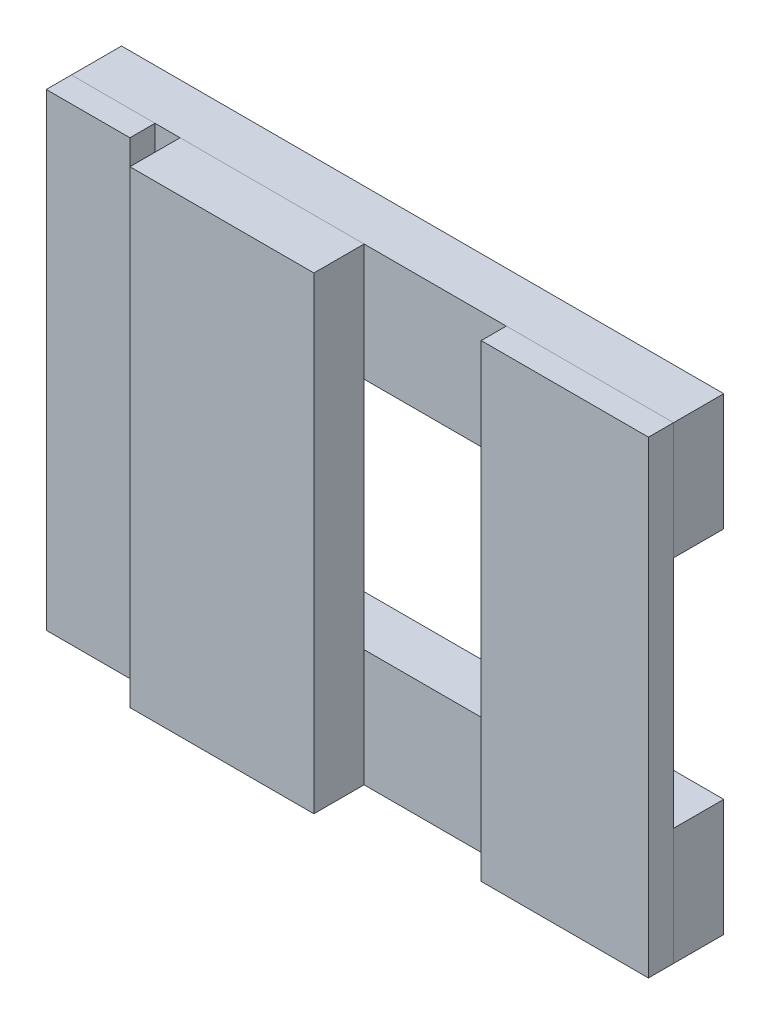
ISO-10303-21;
HEADER;
FILE_DESCRIPTION(('STEP AP214'),'2;1');
FILE_NAME('part.step','',(''),(''),'','','');
FILE_SCHEMA(('AUTOMOTIVE_DESIGN { 1 0 10303 214 1 1 1 1 }'));
ENDSEC;
DATA;
#1=APPLICATION_CONTEXT('core data for automotive mechanical design processes');
#2=APPLICATION_PROTOCOL_DEFINITION('international standard','automotive_design',2000,#1);
#3=PRODUCT_CONTEXT('',#1,'mechanical');
#4=PRODUCT('Part','Part','',(#3));
#5=PRODUCT_RELATED_PRODUCT_CATEGORY('part','',(#4));
#6=PRODUCT_DEFINITION_FORMATION('','',#4);
#7=PRODUCT_DEFINITION_CONTEXT('part definition',#1,'design');
#8=PRODUCT_DEFINITION('design','',#6,#7);
#9=PRODUCT_DEFINITION_SHAPE('','',#8);
#10=(LENGTH_UNIT() NAMED_UNIT(*) SI_UNIT(.MILLI.,.METRE.));
#11=(NAMED_UNIT(*) PLANE_ANGLE_UNIT() SI_UNIT($,.RADIAN.));
#12=(NAMED_UNIT(*) SI_UNIT($,.STERADIAN.) SOLID_ANGLE_UNIT());
#13=UNCERTAINTY_MEASURE_WITH_UNIT(LENGTH_MEASURE(1.E-05),#10,'distance_accuracy_value','');
#14=(GEOMETRIC_REPRESENTATION_CONTEXT(3) GLOBAL_UNCERTAINTY_ASSIGNED_CONTEXT((#13)) GLOBAL_UNIT_ASSIGNED_CONTEXT((#10,
#11,#12)) REPRESENTATION_CONTEXT('',''));
#15=CARTESIAN_POINT('',(0.,0.,0.));
#16=DIRECTION('',(0.,0.,1.));
#17=DIRECTION('',(1.,0.,0.));
#18=AXIS2_PLACEMENT_3D('',#15,#16,#17);
#19=CARTESIAN_POINT('',(-135.111715226845,177.8,76.2));
#20=DIRECTION('',(0.,1.,0.));
#21=DIRECTION('',(0.,0.,1.));
#22=AXIS2_PLACEMENT_3D('',#19,#20,#21);
#23=PLANE('',#22);
#24=DIRECTION('',(1.,0.,0.));
#25=VECTOR('',#24,1.);
#26=CARTESIAN_POINT('',(-135.111715226845,177.8,38.1));
#27=LINE('',#26,#25);
#28=CARTESIAN_POINT('',(-135.111715226845,177.8,38.1));
#29=VERTEX_POINT('',#28);
#30=CARTESIAN_POINT('',(4.58828477315457,177.8,38.1));
#31=VERTEX_POINT('',#30);
#32=EDGE_CURVE('E119',#29,#31,#27,.T.);
#33=ORIENTED_EDGE('',*,*,#32,.F.);
#34=DIRECTION('',(0.,0.,-1.));
#35=VECTOR('',#34,1.);
#36=CARTESIAN_POINT('',(-135.111715226845,177.8,76.2));
#37=LINE('',#36,#35);
#38=CARTESIAN_POINT('',(-135.111715226845,177.8,76.2));
#39=VERTEX_POINT('',#38);
#40=EDGE_CURVE('E12',#39,#29,#37,.T.);
#41=ORIENTED_EDGE('',*,*,#40,.F.);
#42=DIRECTION('',(1.,0.,0.));
#43=VECTOR('',#42,1.);
#44=CARTESIAN_POINT('',(-135.111715226845,177.8,76.2));
#45=LINE('',#44,#43);
#46=CARTESIAN_POINT('',(4.58828477315457,177.8,76.2));
#47=VERTEX_POINT('',#46);
#48=EDGE_CURVE('E114',#39,#47,#45,.T.);
#49=ORIENTED_EDGE('',*,*,#48,.T.);
#50=DIRECTION('',(0.,0.,-1.));
#51=VECTOR('',#50,1.);
#52=CARTESIAN_POINT('',(4.58828477315457,177.8,76.2));
#53=LINE('',#52,#51);
#54=EDGE_CURVE('E57',#47,#31,#53,.T.);
#55=ORIENTED_EDGE('',*,*,#54,.T.);
#56=EDGE_LOOP('',(#33,#41,#49,#55));
#57=FACE_BOUND('',#56,.T.);
#58=ADVANCED_FACE('F54',(#57),#23,.T.);
#59=CARTESIAN_POINT('',(-135.111715226845,177.8,76.2));
#60=DIRECTION('',(1.,0.,0.));
#61=DIRECTION('',(0.,1.,0.));
#62=AXIS2_PLACEMENT_3D('',#59,#60,#61);
#63=PLANE('',#62);
#64=DIRECTION('',(0.,-1.,0.));
#65=VECTOR('',#64,1.);
#66=CARTESIAN_POINT('',(-135.111715226845,177.8,38.1));
#67=LINE('',#66,#65);
#68=CARTESIAN_POINT('',(-135.111715226845,-177.8,38.1));
#69=VERTEX_POINT('',#68);
#70=EDGE_CURVE('E87',#29,#69,#67,.T.);
#71=ORIENTED_EDGE('',*,*,#70,.T.);
#72=DIRECTION('',(0.,0.,-1.));
#73=VECTOR('',#72,1.);
#74=CARTESIAN_POINT('',(-135.111715226845,-177.8,76.2));
#75=LINE('',#74,#73);
#76=CARTESIAN_POINT('',(-135.111715226845,-177.8,76.2));
#77=VERTEX_POINT('',#76);
#78=EDGE_CURVE('E63',#77,#69,#75,.T.);
#79=ORIENTED_EDGE('',*,*,#78,.F.);
#80=DIRECTION('',(0.,-1.,0.));
#81=VECTOR('',#80,1.);
#82=CARTESIAN_POINT('',(-135.111715226845,177.8,76.2));
#83=LINE('',#82,#81);
#84=EDGE_CURVE('E104',#39,#77,#83,.T.);
#85=ORIENTED_EDGE('',*,*,#84,.F.);
#86=ORIENTED_EDGE('',*,*,#40,.T.);
#87=EDGE_LOOP('',(#71,#79,#85,#86));
#88=FACE_BOUND('',#87,.T.);
#89=ADVANCED_FACE('F129',(#88),#63,.F.);
#90=CARTESIAN_POINT('',(-135.111715226845,-177.8,76.2));
#91=DIRECTION('',(0.,1.,0.));
#92=DIRECTION('',(0.,0.,1.));
#93=AXIS2_PLACEMENT_3D('',#90,#91,#92);
#94=PLANE('',#93);
#95=DIRECTION('',(1.,0.,0.));
#96=VECTOR('',#95,1.);
#97=CARTESIAN_POINT('',(-135.111715226845,-177.8,38.1));
#98=LINE('',#97,#96);
#99=CARTESIAN_POINT('',(4.58828477315462,-177.8,38.1));
#100=VERTEX_POINT('',#99);
#101=EDGE_CURVE('E111',#69,#100,#98,.T.);
#102=ORIENTED_EDGE('',*,*,#101,.T.);
#103=DIRECTION('',(0.,0.,-1.));
#104=VECTOR('',#103,1.);
#105=CARTESIAN_POINT('',(4.58828477315462,-177.8,76.2));
#106=LINE('',#105,#104);
#107=CARTESIAN_POINT('',(4.58828477315462,-177.8,76.2));
#108=VERTEX_POINT('',#107);
#109=EDGE_CURVE('E108',#108,#100,#106,.T.);
#110=ORIENTED_EDGE('',*,*,#109,.F.);
#111=DIRECTION('',(1.,0.,0.));
#112=VECTOR('',#111,1.);
#113=CARTESIAN_POINT('',(-135.111715226845,-177.8,76.2));
#114=LINE('',#113,#112);
#115=EDGE_CURVE('E99',#77,#108,#114,.T.);
#116=ORIENTED_EDGE('',*,*,#115,.F.);
#117=ORIENTED_EDGE('',*,*,#78,.T.);
#118=EDGE_LOOP('',(#102,#110,#116,#117));
#119=FACE_BOUND('',#118,.T.);
#120=ADVANCED_FACE('F109',(#119),#94,.F.);
#121=CARTESIAN_POINT('',(4.58828477315457,177.8,76.2));
#122=DIRECTION('',(1.,0.,0.));
#123=DIRECTION('',(0.,1.,0.));
#124=AXIS2_PLACEMENT_3D('',#121,#122,#123);
#125=PLANE('',#124);
#126=DIRECTION('',(0.,-1.,0.));
#127=VECTOR('',#126,1.);
#128=CARTESIAN_POINT('',(4.58828477315457,177.8,38.1));
#129=LINE('',#128,#127);
#130=EDGE_CURVE('E122',#31,#100,#129,.T.);
#131=ORIENTED_EDGE('',*,*,#130,.F.);
#132=ORIENTED_EDGE('',*,*,#54,.F.);
#133=DIRECTION('',(0.,-1.,0.));
#134=VECTOR('',#133,1.);
#135=CARTESIAN_POINT('',(4.58828477315457,177.8,76.2));
#136=LINE('',#135,#134);
#137=EDGE_CURVE('E103',#47,#108,#136,.T.);
#138=ORIENTED_EDGE('',*,*,#137,.T.);
#139=ORIENTED_EDGE('',*,*,#109,.T.);
#140=EDGE_LOOP('',(#131,#132,#138,#139));
#141=FACE_BOUND('',#140,.T.);
#142=ADVANCED_FACE('F113',(#141),#125,.T.);
#143=CARTESIAN_POINT('',(0.,0.,76.2));
#144=DIRECTION('',(0.,0.,-1.));
#145=DIRECTION('',(-1.,0.,0.));
#146=AXIS2_PLACEMENT_3D('',#143,#144,#145);
#147=PLANE('',#146);
#148=ORIENTED_EDGE('',*,*,#48,.F.);
#149=ORIENTED_EDGE('',*,*,#84,.T.);
#150=ORIENTED_EDGE('',*,*,#115,.T.);
#151=ORIENTED_EDGE('',*,*,#137,.F.);
#152=EDGE_LOOP('',(#148,#149,#150,#151));
#153=FACE_BOUND('',#152,.T.);
#154=ADVANCED_FACE('F102',(#153),#147,.F.);
#155=CARTESIAN_POINT('',(0.,0.,38.1));
#156=DIRECTION('',(0.,0.,-1.));
#157=DIRECTION('',(-1.,0.,0.));
#158=AXIS2_PLACEMENT_3D('',#155,#156,#157);
#159=PLANE('',#158);
#160=ORIENTED_EDGE('',*,*,#32,.T.);
#161=ORIENTED_EDGE('',*,*,#130,.T.);
#162=ORIENTED_EDGE('',*,*,#101,.F.);
#163=ORIENTED_EDGE('',*,*,#70,.F.);
#164=EDGE_LOOP('',(#160,#161,#162,#163));
#165=FACE_BOUND('',#164,.T.);
#166=ADVANCED_FACE('F127',(#165),#159,.T.);
#167=CLOSED_SHELL('',(#58,#89,#120,#142,#154,#166));
#168=MANIFOLD_SOLID_BREP('B2',#167);
#169=CARTESIAN_POINT('',(-217.661715226846,177.8,57.15));
#170=DIRECTION('',(0.,1.,0.));
#171=DIRECTION('',(0.,0.,1.));
#172=AXIS2_PLACEMENT_3D('',#169,#170,#171);
#173=PLANE('',#172);
#174=DIRECTION('',(1.,0.,0.));
#175=VECTOR('',#174,1.);
#176=CARTESIAN_POINT('',(-217.661715226846,177.8,38.1));
#177=LINE('',#176,#175);
#178=CARTESIAN_POINT('',(-217.661715226846,177.8,38.1));
#179=VERTEX_POINT('',#178);
#180=CARTESIAN_POINT('',(-154.161715226846,177.8,38.1));
#181=VERTEX_POINT('',#180);
#182=EDGE_CURVE('E52',#179,#181,#177,.T.);
#183=ORIENTED_EDGE('',*,*,#182,.F.);
#184=DIRECTION('',(0.,0.,-1.));
#185=VECTOR('',#184,1.);
#186=CARTESIAN_POINT('',(-217.661715226846,177.8,57.15));
#187=LINE('',#186,#185);
#188=CARTESIAN_POINT('',(-217.661715226846,177.8,57.15));
#189=VERTEX_POINT('',#188);
#190=EDGE_CURVE('E234',#189,#179,#187,.T.);
#191=ORIENTED_EDGE('',*,*,#190,.F.);
#192=DIRECTION('',(1.,0.,0.));
#193=VECTOR('',#192,1.);
#194=CARTESIAN_POINT('',(-217.661715226846,177.8,57.15));
#195=LINE('',#194,#193);
#196=CARTESIAN_POINT('',(-154.161715226846,177.8,57.15));
#197=VERTEX_POINT('',#196);
#198=EDGE_CURVE('E192',#189,#197,#195,.T.);
#199=ORIENTED_EDGE('',*,*,#198,.T.);
#200=DIRECTION('',(0.,0.,-1.));
#201=VECTOR('',#200,1.);
#202=CARTESIAN_POINT('',(-154.161715226846,177.8,57.15));
#203=LINE('',#202,#201);
#204=EDGE_CURVE('E207',#197,#181,#203,.T.);
#205=ORIENTED_EDGE('',*,*,#204,.T.);
#206=EDGE_LOOP('',(#183,#191,#199,#205));
#207=FACE_BOUND('',#206,.T.);
#208=ADVANCED_FACE('F188',(#207),#173,.T.);
#209=CARTESIAN_POINT('',(-217.661715226846,177.8,57.15));
#210=DIRECTION('',(1.,0.,0.));
#211=DIRECTION('',(0.,0.,-1.));
#212=AXIS2_PLACEMENT_3D('',#209,#210,#211);
#213=PLANE('',#212);
#214=DIRECTION('',(0.,-1.,0.));
#215=VECTOR('',#214,1.);
#216=CARTESIAN_POINT('',(-217.661715226846,177.8,38.1));
#217=LINE('',#216,#215);
#218=CARTESIAN_POINT('',(-217.661715226846,-177.8,38.1));
#219=VERTEX_POINT('',#218);
#220=EDGE_CURVE('E237',#179,#219,#217,.T.);
#221=ORIENTED_EDGE('',*,*,#220,.T.);
#222=DIRECTION('',(0.,0.,-1.));
#223=VECTOR('',#222,1.);
#224=CARTESIAN_POINT('',(-217.661715226846,-177.8,57.15));
#225=LINE('',#224,#223);
#226=CARTESIAN_POINT('',(-217.661715226846,-177.8,57.15));
#227=VERTEX_POINT('',#226);
#228=EDGE_CURVE('E240',#227,#219,#225,.T.);
#229=ORIENTED_EDGE('',*,*,#228,.F.);
#230=DIRECTION('',(0.,-1.,0.));
#231=VECTOR('',#230,1.);
#232=CARTESIAN_POINT('',(-217.661715226846,177.8,57.15));
#233=LINE('',#232,#231);
#234=EDGE_CURVE('E256',#189,#227,#233,.T.);
#235=ORIENTED_EDGE('',*,*,#234,.F.);
#236=ORIENTED_EDGE('',*,*,#190,.T.);
#237=EDGE_LOOP('',(#221,#229,#235,#236));
#238=FACE_BOUND('',#237,.T.);
#239=ADVANCED_FACE('F239',(#238),#213,.F.);
#240=CARTESIAN_POINT('',(-217.661715226846,-177.8,57.15));
#241=DIRECTION('',(0.,1.,0.));
#242=DIRECTION('',(0.,0.,1.));
#243=AXIS2_PLACEMENT_3D('',#240,#241,#242);
#244=PLANE('',#243);
#245=DIRECTION('',(1.,0.,0.));
#246=VECTOR('',#245,1.);
#247=CARTESIAN_POINT('',(-217.661715226846,-177.8,38.1));
#248=LINE('',#247,#246);
#249=CARTESIAN_POINT('',(-154.161715226845,-177.8,38.1));
#250=VERTEX_POINT('',#249);
#251=EDGE_CURVE('E243',#219,#250,#248,.T.);
#252=ORIENTED_EDGE('',*,*,#251,.T.);
#253=DIRECTION('',(0.,0.,-1.));
#254=VECTOR('',#253,1.);
#255=CARTESIAN_POINT('',(-154.161715226845,-177.8,57.15));
#256=LINE('',#255,#254);
#257=CARTESIAN_POINT('',(-154.161715226845,-177.8,57.15));
#258=VERTEX_POINT('',#257);
#259=EDGE_CURVE('E249',#258,#250,#256,.T.);
#260=ORIENTED_EDGE('',*,*,#259,.F.);
#261=DIRECTION('',(1.,0.,0.));
#262=VECTOR('',#261,1.);
#263=CARTESIAN_POINT('',(-217.661715226846,-177.8,57.15));
#264=LINE('',#263,#262);
#265=EDGE_CURVE('E224',#227,#258,#264,.T.);
#266=ORIENTED_EDGE('',*,*,#265,.F.);
#267=ORIENTED_EDGE('',*,*,#228,.T.);
#268=EDGE_LOOP('',(#252,#260,#266,#267));
#269=FACE_BOUND('',#268,.T.);
#270=ADVANCED_FACE('F247',(#269),#244,.F.);
#271=CARTESIAN_POINT('',(-154.161715226846,177.8,57.15));
#272=DIRECTION('',(1.,0.,0.));
#273=DIRECTION('',(0.,1.,0.));
#274=AXIS2_PLACEMENT_3D('',#271,#272,#273);
#275=PLANE('',#274);
#276=DIRECTION('',(0.,-1.,0.));
#277=VECTOR('',#276,1.);
#278=CARTESIAN_POINT('',(-154.161715226846,177.8,38.1));
#279=LINE('',#278,#277);
#280=EDGE_CURVE('E198',#181,#250,#279,.T.);
#281=ORIENTED_EDGE('',*,*,#280,.F.);
#282=ORIENTED_EDGE('',*,*,#204,.F.);
#283=DIRECTION('',(0.,-1.,0.));
#284=VECTOR('',#283,1.);
#285=CARTESIAN_POINT('',(-154.161715226846,177.8,57.15));
#286=LINE('',#285,#284);
#287=EDGE_CURVE('E258',#197,#258,#286,.T.);
#288=ORIENTED_EDGE('',*,*,#287,.T.);
#289=ORIENTED_EDGE('',*,*,#259,.T.);
#290=EDGE_LOOP('',(#281,#282,#288,#289));
#291=FACE_BOUND('',#290,.T.);
#292=ADVANCED_FACE('F261',(#291),#275,.T.);
#293=CARTESIAN_POINT('',(0.,0.,57.15));
#294=DIRECTION('',(0.,0.,-1.));
#295=DIRECTION('',(-1.,0.,0.));
#296=AXIS2_PLACEMENT_3D('',#293,#294,#295);
#297=PLANE('',#296);
#298=ORIENTED_EDGE('',*,*,#198,.F.);
#299=ORIENTED_EDGE('',*,*,#234,.T.);
#300=ORIENTED_EDGE('',*,*,#265,.T.);
#301=ORIENTED_EDGE('',*,*,#287,.F.);
#302=EDGE_LOOP('',(#298,#299,#300,#301));
#303=FACE_BOUND('',#302,.T.);
#304=ADVANCED_FACE('F190',(#303),#297,.F.);
#305=CARTESIAN_POINT('',(0.,0.,38.1));
#306=DIRECTION('',(0.,0.,-1.));
#307=DIRECTION('',(-1.,0.,0.));
#308=AXIS2_PLACEMENT_3D('',#305,#306,#307);
#309=PLANE('',#308);
#310=ORIENTED_EDGE('',*,*,#182,.T.);
#311=ORIENTED_EDGE('',*,*,#280,.T.);
#312=ORIENTED_EDGE('',*,*,#251,.F.);
#313=ORIENTED_EDGE('',*,*,#220,.F.);
#314=EDGE_LOOP('',(#310,#311,#312,#313));
#315=FACE_BOUND('',#314,.T.);
#316=ADVANCED_FACE('F251',(#315),#309,.T.);
#317=CLOSED_SHELL('',(#208,#239,#270,#292,#304,#316));
#318=MANIFOLD_SOLID_BREP('B6',#317);
#319=CARTESIAN_POINT('',(239.538284773155,0.,57.15));
#320=DIRECTION('',(1.,0.,0.));
#321=DIRECTION('',(0.,0.,-1.));
#322=AXIS2_PLACEMENT_3D('',#319,#320,#321);
#323=PLANE('',#322);
#324=DIRECTION('',(0.,-1.,0.));
#325=VECTOR('',#324,1.);
#326=CARTESIAN_POINT('',(239.538284773155,0.,38.1));
#327=LINE('',#326,#325);
#328=CARTESIAN_POINT('',(239.538284773154,177.8,38.1));
#329=VERTEX_POINT('',#328);
#330=CARTESIAN_POINT('',(239.538284773155,-177.8,38.1));
#331=VERTEX_POINT('',#330);
#332=EDGE_CURVE('E385',#329,#331,#327,.T.);
#333=ORIENTED_EDGE('',*,*,#332,.F.);
#334=DIRECTION('',(0.,0.,-1.));
#335=VECTOR('',#334,1.);
#336=CARTESIAN_POINT('',(239.538284773154,177.8,57.15));
#337=LINE('',#336,#335);
#338=CARTESIAN_POINT('',(239.538284773154,177.8,57.15));
#339=VERTEX_POINT('',#338);
#340=EDGE_CURVE('E186',#339,#329,#337,.T.);
#341=ORIENTED_EDGE('',*,*,#340,.F.);
#342=DIRECTION('',(0.,-1.,0.));
#343=VECTOR('',#342,1.);
#344=CARTESIAN_POINT('',(239.538284773155,0.,57.15));
#345=LINE('',#344,#343);
#346=CARTESIAN_POINT('',(239.538284773155,-177.8,57.15));
#347=VERTEX_POINT('',#346);
#348=EDGE_CURVE('E370',#339,#347,#345,.T.);
#349=ORIENTED_EDGE('',*,*,#348,.T.);
#350=DIRECTION('',(0.,0.,-1.));
#351=VECTOR('',#350,1.);
#352=CARTESIAN_POINT('',(239.538284773155,-177.8,57.15));
#353=LINE('',#352,#351);
#354=EDGE_CURVE('E338',#347,#331,#353,.T.);
#355=ORIENTED_EDGE('',*,*,#354,.T.);
#356=EDGE_LOOP('',(#333,#341,#349,#355));
#357=FACE_BOUND('',#356,.T.);
#358=ADVANCED_FACE('F322',(#357),#323,.T.);
#359=CARTESIAN_POINT('',(0.,177.8,57.15));
#360=DIRECTION('',(0.,-1.,0.));
#361=DIRECTION('',(0.,0.,-1.));
#362=AXIS2_PLACEMENT_3D('',#359,#360,#361);
#363=PLANE('',#362);
#364=DIRECTION('',(-1.,0.,0.));
#365=VECTOR('',#364,1.);
#366=CARTESIAN_POINT('',(0.,177.8,38.1));
#367=LINE('',#366,#365);
#368=CARTESIAN_POINT('',(112.538284773155,177.8,38.1));
#369=VERTEX_POINT('',#368);
#370=EDGE_CURVE('E376',#329,#369,#367,.T.);
#371=ORIENTED_EDGE('',*,*,#370,.T.);
#372=DIRECTION('',(0.,0.,-1.));
#373=VECTOR('',#372,1.);
#374=CARTESIAN_POINT('',(112.538284773155,177.8,57.15));
#375=LINE('',#374,#373);
#376=CARTESIAN_POINT('',(112.538284773155,177.8,57.15));
#377=VERTEX_POINT('',#376);
#378=EDGE_CURVE('E330',#377,#369,#375,.T.);
#379=ORIENTED_EDGE('',*,*,#378,.F.);
#380=DIRECTION('',(-1.,0.,0.));
#381=VECTOR('',#380,1.);
#382=CARTESIAN_POINT('',(0.,177.8,57.15));
#383=LINE('',#382,#381);
#384=EDGE_CURVE('E364',#339,#377,#383,.T.);
#385=ORIENTED_EDGE('',*,*,#384,.F.);
#386=ORIENTED_EDGE('',*,*,#340,.T.);
#387=EDGE_LOOP('',(#371,#379,#385,#386));
#388=FACE_BOUND('',#387,.T.);
#389=ADVANCED_FACE('F374',(#388),#363,.F.);
#390=CARTESIAN_POINT('',(112.538284773155,0.,57.15));
#391=DIRECTION('',(1.,0.,0.));
#392=DIRECTION('',(0.,1.,0.));
#393=AXIS2_PLACEMENT_3D('',#390,#391,#392);
#394=PLANE('',#393);
#395=DIRECTION('',(0.,-1.,0.));
#396=VECTOR('',#395,1.);
#397=CARTESIAN_POINT('',(112.538284773155,0.,38.1));
#398=LINE('',#397,#396);
#399=CARTESIAN_POINT('',(112.538284773155,-177.8,38.1));
#400=VERTEX_POINT('',#399);
#401=EDGE_CURVE('E388',#369,#400,#398,.T.);
#402=ORIENTED_EDGE('',*,*,#401,.T.);
#403=DIRECTION('',(0.,0.,-1.));
#404=VECTOR('',#403,1.);
#405=CARTESIAN_POINT('',(112.538284773155,-177.8,57.15));
#406=LINE('',#405,#404);
#407=CARTESIAN_POINT('',(112.538284773155,-177.8,57.15));
#408=VERTEX_POINT('',#407);
#409=EDGE_CURVE('E352',#408,#400,#406,.T.);
#410=ORIENTED_EDGE('',*,*,#409,.F.);
#411=DIRECTION('',(0.,-1.,0.));
#412=VECTOR('',#411,1.);
#413=CARTESIAN_POINT('',(112.538284773155,0.,57.15));
#414=LINE('',#413,#412);
#415=EDGE_CURVE('E369',#377,#408,#414,.T.);
#416=ORIENTED_EDGE('',*,*,#415,.F.);
#417=ORIENTED_EDGE('',*,*,#378,.T.);
#418=EDGE_LOOP('',(#402,#410,#416,#417));
#419=FACE_BOUND('',#418,.T.);
#420=ADVANCED_FACE('F379',(#419),#394,.F.);
#421=CARTESIAN_POINT('',(0.,-177.8,57.15));
#422=DIRECTION('',(0.,-1.,0.));
#423=DIRECTION('',(0.,0.,-1.));
#424=AXIS2_PLACEMENT_3D('',#421,#422,#423);
#425=PLANE('',#424);
#426=DIRECTION('',(-1.,0.,0.));
#427=VECTOR('',#426,1.);
#428=CARTESIAN_POINT('',(0.,-177.8,38.1));
#429=LINE('',#428,#427);
#430=EDGE_CURVE('E390',#331,#400,#429,.T.);
#431=ORIENTED_EDGE('',*,*,#430,.F.);
#432=ORIENTED_EDGE('',*,*,#354,.F.);
#433=DIRECTION('',(-1.,0.,0.));
#434=VECTOR('',#433,1.);
#435=CARTESIAN_POINT('',(0.,-177.8,57.15));
#436=LINE('',#435,#434);
#437=EDGE_CURVE('E380',#347,#408,#436,.T.);
#438=ORIENTED_EDGE('',*,*,#437,.T.);
#439=ORIENTED_EDGE('',*,*,#409,.T.);
#440=EDGE_LOOP('',(#431,#432,#438,#439));
#441=FACE_BOUND('',#440,.T.);
#442=ADVANCED_FACE('F395',(#441),#425,.T.);
#443=CARTESIAN_POINT('',(0.,0.,57.15));
#444=DIRECTION('',(0.,0.,1.));
#445=DIRECTION('',(1.,0.,0.));
#446=AXIS2_PLACEMENT_3D('',#443,#444,#445);
#447=PLANE('',#446);
#448=ORIENTED_EDGE('',*,*,#348,.F.);
#449=ORIENTED_EDGE('',*,*,#384,.T.);
#450=ORIENTED_EDGE('',*,*,#415,.T.);
#451=ORIENTED_EDGE('',*,*,#437,.F.);
#452=EDGE_LOOP('',(#448,#449,#450,#451));
#453=FACE_BOUND('',#452,.T.);
#454=ADVANCED_FACE('F366',(#453),#447,.T.);
#455=CARTESIAN_POINT('',(0.,0.,38.1));
#456=DIRECTION('',(0.,0.,1.));
#457=DIRECTION('',(1.,0.,0.));
#458=AXIS2_PLACEMENT_3D('',#455,#456,#457);
#459=PLANE('',#458);
#460=ORIENTED_EDGE('',*,*,#332,.T.);
#461=ORIENTED_EDGE('',*,*,#430,.T.);
#462=ORIENTED_EDGE('',*,*,#401,.F.);
#463=ORIENTED_EDGE('',*,*,#370,.F.);
#464=EDGE_LOOP('',(#460,#461,#462,#463));
#465=FACE_BOUND('',#464,.T.);
#466=ADVANCED_FACE('F402',(#465),#459,.F.);
#467=CLOSED_SHELL('',(#358,#389,#420,#442,#454,#466));
#468=MANIFOLD_SOLID_BREP('B46',#467);
#469=CARTESIAN_POINT('',(-217.661715226846,-177.8,38.1));
#470=DIRECTION('',(1.,0.,0.));
#471=DIRECTION('',(0.,1.,0.));
#472=AXIS2_PLACEMENT_3D('',#469,#470,#471);
#473=PLANE('',#472);
#474=DIRECTION('',(0.,-1.,0.));
#475=VECTOR('',#474,1.);
#476=CARTESIAN_POINT('',(-217.661715226846,-177.8,0.));
#477=LINE('',#476,#475);
#478=CARTESIAN_POINT('',(-217.661715226845,-88.9,0.));
#479=VERTEX_POINT('',#478);
#480=CARTESIAN_POINT('',(-217.661715226846,-177.8,0.));
#481=VERTEX_POINT('',#480);
#482=EDGE_CURVE('E320',#479,#481,#477,.T.);
#483=ORIENTED_EDGE('',*,*,#482,.T.);
#484=DIRECTION('',(0.,0.,-1.));
#485=VECTOR('',#484,1.);
#486=CARTESIAN_POINT('',(-217.661715226846,-177.8,38.1));
#487=LINE('',#486,#485);
#488=CARTESIAN_POINT('',(-217.661715226846,-177.8,38.1));
#489=VERTEX_POINT('',#488);
#490=EDGE_CURVE('E538',#489,#481,#487,.T.);
#491=ORIENTED_EDGE('',*,*,#490,.F.);
#492=DIRECTION('',(0.,-1.,0.));
#493=VECTOR('',#492,1.);
#494=CARTESIAN_POINT('',(-217.661715226846,-177.8,38.1));
#495=LINE('',#494,#493);
#496=CARTESIAN_POINT('',(-217.661715226845,-88.9,38.1));
#497=VERTEX_POINT('',#496);
#498=EDGE_CURVE('E471',#497,#489,#495,.T.);
#499=ORIENTED_EDGE('',*,*,#498,.F.);
#500=DIRECTION('',(0.,0.,-1.));
#501=VECTOR('',#500,1.);
#502=CARTESIAN_POINT('',(-217.661715226845,-88.9,38.1));
#503=LINE('',#502,#501);
#504=EDGE_CURVE('E526',#497,#479,#503,.T.);
#505=ORIENTED_EDGE('',*,*,#504,.T.);
#506=EDGE_LOOP('',(#483,#491,#499,#505));
#507=FACE_BOUND('',#506,.T.);
#508=ADVANCED_FACE('F467',(#507),#473,.F.);
#509=CARTESIAN_POINT('',(-217.661715226846,-177.8,38.1));
#510=DIRECTION('',(0.,1.,0.));
#511=DIRECTION('',(0.,0.,1.));
#512=AXIS2_PLACEMENT_3D('',#509,#510,#511);
#513=PLANE('',#512);
#514=DIRECTION('',(1.,0.,0.));
#515=VECTOR('',#514,1.);
#516=CARTESIAN_POINT('',(-217.661715226846,-177.8,0.));
#517=LINE('',#516,#515);
#518=CARTESIAN_POINT('',(239.538284773155,-177.8,0.));
#519=VERTEX_POINT('',#518);
#520=EDGE_CURVE('E477',#481,#519,#517,.T.);
#521=ORIENTED_EDGE('',*,*,#520,.T.);
#522=DIRECTION('',(0.,0.,-1.));
#523=VECTOR('',#522,1.);
#524=CARTESIAN_POINT('',(239.538284773155,-177.8,38.1));
#525=LINE('',#524,#523);
#526=CARTESIAN_POINT('',(239.538284773155,-177.8,38.1));
#527=VERTEX_POINT('',#526);
#528=EDGE_CURVE('E522',#527,#519,#525,.T.);
#529=ORIENTED_EDGE('',*,*,#528,.F.);
#530=DIRECTION('',(1.,0.,0.));
#531=VECTOR('',#530,1.);
#532=CARTESIAN_POINT('',(-217.661715226846,-177.8,38.1));
#533=LINE('',#532,#531);
#534=EDGE_CURVE('E501',#489,#527,#533,.T.);
#535=ORIENTED_EDGE('',*,*,#534,.F.);
#536=ORIENTED_EDGE('',*,*,#490,.T.);
#537=EDGE_LOOP('',(#521,#529,#535,#536));
#538=FACE_BOUND('',#537,.T.);
#539=ADVANCED_FACE('F541',(#538),#513,.F.);
#540=CARTESIAN_POINT('',(239.538284773155,-177.8,38.1));
#541=DIRECTION('',(-1.,0.,0.));
#542=DIRECTION('',(0.,0.,1.));
#543=AXIS2_PLACEMENT_3D('',#540,#541,#542);
#544=PLANE('',#543);
#545=DIRECTION('',(0.,1.,0.));
#546=VECTOR('',#545,1.);
#547=CARTESIAN_POINT('',(239.538284773155,-177.8,0.));
#548=LINE('',#547,#546);
#549=CARTESIAN_POINT('',(239.538284773155,-88.9,0.));
#550=VERTEX_POINT('',#549);
#551=EDGE_CURVE('E517',#519,#550,#548,.T.);
#552=ORIENTED_EDGE('',*,*,#551,.T.);
#553=DIRECTION('',(0.,0.,-1.));
#554=VECTOR('',#553,1.);
#555=CARTESIAN_POINT('',(239.538284773155,-88.9,38.1));
#556=LINE('',#555,#554);
#557=CARTESIAN_POINT('',(239.538284773155,-88.9,38.1));
#558=VERTEX_POINT('',#557);
#559=EDGE_CURVE('E520',#558,#550,#556,.T.);
#560=ORIENTED_EDGE('',*,*,#559,.F.);
#561=DIRECTION('',(0.,1.,0.));
#562=VECTOR('',#561,1.);
#563=CARTESIAN_POINT('',(239.538284773155,-177.8,38.1));
#564=LINE('',#563,#562);
#565=EDGE_CURVE('E534',#527,#558,#564,.T.);
#566=ORIENTED_EDGE('',*,*,#565,.F.);
#567=ORIENTED_EDGE('',*,*,#528,.T.);
#568=EDGE_LOOP('',(#552,#560,#566,#567));
#569=FACE_BOUND('',#568,.T.);
#570=ADVANCED_FACE('F518',(#569),#544,.F.);
#571=CARTESIAN_POINT('',(-217.661715226845,-88.9,38.1));
#572=DIRECTION('',(0.,-1.,0.));
#573=DIRECTION('',(0.,0.,-1.));
#574=AXIS2_PLACEMENT_3D('',#571,#572,#573);
#575=PLANE('',#574);
#576=DIRECTION('',(-1.,0.,0.));
#577=VECTOR('',#576,1.);
#578=CARTESIAN_POINT('',(-217.661715226845,-88.9,0.));
#579=LINE('',#578,#577);
#580=EDGE_CURVE('E511',#550,#479,#579,.T.);
#581=ORIENTED_EDGE('',*,*,#580,.T.);
#582=ORIENTED_EDGE('',*,*,#504,.F.);
#583=DIRECTION('',(-1.,0.,0.));
#584=VECTOR('',#583,1.);
#585=CARTESIAN_POINT('',(-217.661715226845,-88.9,38.1));
#586=LINE('',#585,#584);
#587=EDGE_CURVE('E525',#558,#497,#586,.T.);
#588=ORIENTED_EDGE('',*,*,#587,.F.);
#589=ORIENTED_EDGE('',*,*,#559,.T.);
#590=EDGE_LOOP('',(#581,#582,#588,#589));
#591=FACE_BOUND('',#590,.T.);
#592=ADVANCED_FACE('F524',(#591),#575,.F.);
#593=CARTESIAN_POINT('',(0.,0.,38.1));
#594=DIRECTION('',(0.,0.,-1.));
#595=DIRECTION('',(-1.,0.,0.));
#596=AXIS2_PLACEMENT_3D('',#593,#594,#595);
#597=PLANE('',#596);
#598=ORIENTED_EDGE('',*,*,#498,.T.);
#599=ORIENTED_EDGE('',*,*,#534,.T.);
#600=ORIENTED_EDGE('',*,*,#565,.T.);
#601=ORIENTED_EDGE('',*,*,#587,.T.);
#602=EDGE_LOOP('',(#598,#599,#600,#601));
#603=FACE_BOUND('',#602,.T.);
#604=ADVANCED_FACE('F469',(#603),#597,.F.);
#605=CARTESIAN_POINT('',(0.,0.,0.));
#606=DIRECTION('',(0.,0.,-1.));
#607=DIRECTION('',(-1.,0.,0.));
#608=AXIS2_PLACEMENT_3D('',#605,#606,#607);
#609=PLANE('',#608);
#610=ORIENTED_EDGE('',*,*,#482,.F.);
#611=ORIENTED_EDGE('',*,*,#580,.F.);
#612=ORIENTED_EDGE('',*,*,#551,.F.);
#613=ORIENTED_EDGE('',*,*,#520,.F.);
#614=EDGE_LOOP('',(#610,#611,#612,#613));
#615=FACE_BOUND('',#614,.T.);
#616=ADVANCED_FACE('F528',(#615),#609,.T.);
#617=CLOSED_SHELL('',(#508,#539,#570,#592,#604,#616));
#618=MANIFOLD_SOLID_BREP('B180',#617);
#619=CARTESIAN_POINT('',(-217.661715226846,177.8,38.1));
#620=DIRECTION('',(1.,0.,0.));
#621=DIRECTION('',(0.,1.,0.));
#622=AXIS2_PLACEMENT_3D('',#619,#620,#621);
#623=PLANE('',#622);
#624=DIRECTION('',(0.,-1.,0.));
#625=VECTOR('',#624,1.);
#626=CARTESIAN_POINT('',(-217.661715226846,177.8,0.));
#627=LINE('',#626,#625);
#628=CARTESIAN_POINT('',(-217.661715226846,177.8,0.));
#629=VERTEX_POINT('',#628);
#630=CARTESIAN_POINT('',(-217.661715226845,88.9,0.));
#631=VERTEX_POINT('',#630);
#632=EDGE_CURVE('E654',#629,#631,#627,.T.);
#633=ORIENTED_EDGE('',*,*,#632,.T.);
#634=DIRECTION('',(0.,0.,-1.));
#635=VECTOR('',#634,1.);
#636=CARTESIAN_POINT('',(-217.661715226845,88.9,38.1));
#637=LINE('',#636,#635);
#638=CARTESIAN_POINT('',(-217.661715226845,88.9,38.1));
#639=VERTEX_POINT('',#638);
#640=EDGE_CURVE('E465',#639,#631,#637,.T.);
#641=ORIENTED_EDGE('',*,*,#640,.F.);
#642=DIRECTION('',(0.,-1.,0.));
#643=VECTOR('',#642,1.);
#644=CARTESIAN_POINT('',(-217.661715226846,177.8,38.1));
#645=LINE('',#644,#643);
#646=CARTESIAN_POINT('',(-217.661715226846,177.8,38.1));
#647=VERTEX_POINT('',#646);
#648=EDGE_CURVE('E642',#647,#639,#645,.T.);
#649=ORIENTED_EDGE('',*,*,#648,.F.);
#650=DIRECTION('',(0.,0.,-1.));
#651=VECTOR('',#650,1.);
#652=CARTESIAN_POINT('',(-217.661715226846,177.8,38.1));
#653=LINE('',#652,#651);
#654=EDGE_CURVE('E650',#647,#629,#653,.T.);
#655=ORIENTED_EDGE('',*,*,#654,.T.);
#656=EDGE_LOOP('',(#633,#641,#649,#655));
#657=FACE_BOUND('',#656,.T.);
#658=ADVANCED_FACE('F591',(#657),#623,.F.);
#659=CARTESIAN_POINT('',(-217.661715226845,88.9,38.1));
#660=DIRECTION('',(0.,1.,0.));
#661=DIRECTION('',(0.,0.,1.));
#662=AXIS2_PLACEMENT_3D('',#659,#660,#661);
#663=PLANE('',#662);
#664=DIRECTION('',(1.,0.,0.));
#665=VECTOR('',#664,1.);
#666=CARTESIAN_POINT('',(-217.661715226845,88.9,0.));
#667=LINE('',#666,#665);
#668=CARTESIAN_POINT('',(239.538284773155,88.9,0.));
#669=VERTEX_POINT('',#668);
#670=EDGE_CURVE('E646',#631,#669,#667,.T.);
#671=ORIENTED_EDGE('',*,*,#670,.T.);
#672=DIRECTION('',(0.,0.,-1.));
#673=VECTOR('',#672,1.);
#674=CARTESIAN_POINT('',(239.538284773155,88.9,38.1));
#675=LINE('',#674,#673);
#676=CARTESIAN_POINT('',(239.538284773155,88.9,38.1));
#677=VERTEX_POINT('',#676);
#678=EDGE_CURVE('E599',#677,#669,#675,.T.);
#679=ORIENTED_EDGE('',*,*,#678,.F.);
#680=DIRECTION('',(1.,0.,0.));
#681=VECTOR('',#680,1.);
#682=CARTESIAN_POINT('',(-217.661715226845,88.9,38.1));
#683=LINE('',#682,#681);
#684=EDGE_CURVE('E637',#639,#677,#683,.T.);
#685=ORIENTED_EDGE('',*,*,#684,.F.);
#686=ORIENTED_EDGE('',*,*,#640,.T.);
#687=EDGE_LOOP('',(#671,#679,#685,#686));
#688=FACE_BOUND('',#687,.T.);
#689=ADVANCED_FACE('F645',(#688),#663,.F.);
#690=CARTESIAN_POINT('',(239.538284773155,177.8,38.1));
#691=DIRECTION('',(-1.,0.,0.));
#692=DIRECTION('',(0.,0.,1.));
#693=AXIS2_PLACEMENT_3D('',#690,#691,#692);
#694=PLANE('',#693);
#695=DIRECTION('',(0.,1.,0.));
#696=VECTOR('',#695,1.);
#697=CARTESIAN_POINT('',(239.538284773155,177.8,0.));
#698=LINE('',#697,#696);
#699=CARTESIAN_POINT('',(239.538284773155,177.8,0.));
#700=VERTEX_POINT('',#699);
#701=EDGE_CURVE('E624',#669,#700,#698,.T.);
#702=ORIENTED_EDGE('',*,*,#701,.T.);
#703=DIRECTION('',(0.,0.,-1.));
#704=VECTOR('',#703,1.);
#705=CARTESIAN_POINT('',(239.538284773155,177.8,38.1));
#706=LINE('',#705,#704);
#707=CARTESIAN_POINT('',(239.538284773155,177.8,38.1));
#708=VERTEX_POINT('',#707);
#709=EDGE_CURVE('E647',#708,#700,#706,.T.);
#710=ORIENTED_EDGE('',*,*,#709,.F.);
#711=DIRECTION('',(0.,1.,0.));
#712=VECTOR('',#711,1.);
#713=CARTESIAN_POINT('',(239.538284773155,177.8,38.1));
#714=LINE('',#713,#712);
#715=EDGE_CURVE('E640',#677,#708,#714,.T.);
#716=ORIENTED_EDGE('',*,*,#715,.F.);
#717=ORIENTED_EDGE('',*,*,#678,.T.);
#718=EDGE_LOOP('',(#702,#710,#716,#717));
#719=FACE_BOUND('',#718,.T.);
#720=ADVANCED_FACE('F648',(#719),#694,.F.);
#721=CARTESIAN_POINT('',(-217.661715226846,177.8,38.1));
#722=DIRECTION('',(0.,-1.,0.));
#723=DIRECTION('',(0.,0.,-1.));
#724=AXIS2_PLACEMENT_3D('',#721,#722,#723);
#725=PLANE('',#724);
#726=DIRECTION('',(-1.,0.,0.));
#727=VECTOR('',#726,1.);
#728=CARTESIAN_POINT('',(-217.661715226846,177.8,0.));
#729=LINE('',#728,#727);
#730=EDGE_CURVE('E630',#700,#629,#729,.T.);
#731=ORIENTED_EDGE('',*,*,#730,.T.);
#732=ORIENTED_EDGE('',*,*,#654,.F.);
#733=DIRECTION('',(-1.,0.,0.));
#734=VECTOR('',#733,1.);
#735=CARTESIAN_POINT('',(-217.661715226846,177.8,38.1));
#736=LINE('',#735,#734);
#737=EDGE_CURVE('E607',#708,#647,#736,.T.);
#738=ORIENTED_EDGE('',*,*,#737,.F.);
#739=ORIENTED_EDGE('',*,*,#709,.T.);
#740=EDGE_LOOP('',(#731,#732,#738,#739));
#741=FACE_BOUND('',#740,.T.);
#742=ADVANCED_FACE('F661',(#741),#725,.F.);
#743=CARTESIAN_POINT('',(0.,0.,38.1));
#744=DIRECTION('',(0.,0.,1.));
#745=DIRECTION('',(1.,0.,0.));
#746=AXIS2_PLACEMENT_3D('',#743,#744,#745);
#747=PLANE('',#746);
#748=ORIENTED_EDGE('',*,*,#648,.T.);
#749=ORIENTED_EDGE('',*,*,#684,.T.);
#750=ORIENTED_EDGE('',*,*,#715,.T.);
#751=ORIENTED_EDGE('',*,*,#737,.T.);
#752=EDGE_LOOP('',(#748,#749,#750,#751));
#753=FACE_BOUND('',#752,.T.);
#754=ADVANCED_FACE('F638',(#753),#747,.T.);
#755=CARTESIAN_POINT('',(0.,0.,0.));
#756=DIRECTION('',(0.,0.,1.));
#757=DIRECTION('',(1.,0.,0.));
#758=AXIS2_PLACEMENT_3D('',#755,#756,#757);
#759=PLANE('',#758);
#760=ORIENTED_EDGE('',*,*,#632,.F.);
#761=ORIENTED_EDGE('',*,*,#730,.F.);
#762=ORIENTED_EDGE('',*,*,#701,.F.);
#763=ORIENTED_EDGE('',*,*,#670,.F.);
#764=EDGE_LOOP('',(#760,#761,#762,#763));
#765=FACE_BOUND('',#764,.T.);
#766=ADVANCED_FACE('F664',(#765),#759,.F.);
#767=CLOSED_SHELL('',(#658,#689,#720,#742,#754,#766));
#768=MANIFOLD_SOLID_BREP('B314',#767);
#769=ADVANCED_BREP_SHAPE_REPRESENTATION('',(#18,#168,#318,#468,#618,#768),#14);
#770=SHAPE_DEFINITION_REPRESENTATION(#9,#769);
ENDSEC;
END-ISO-10303-21;
